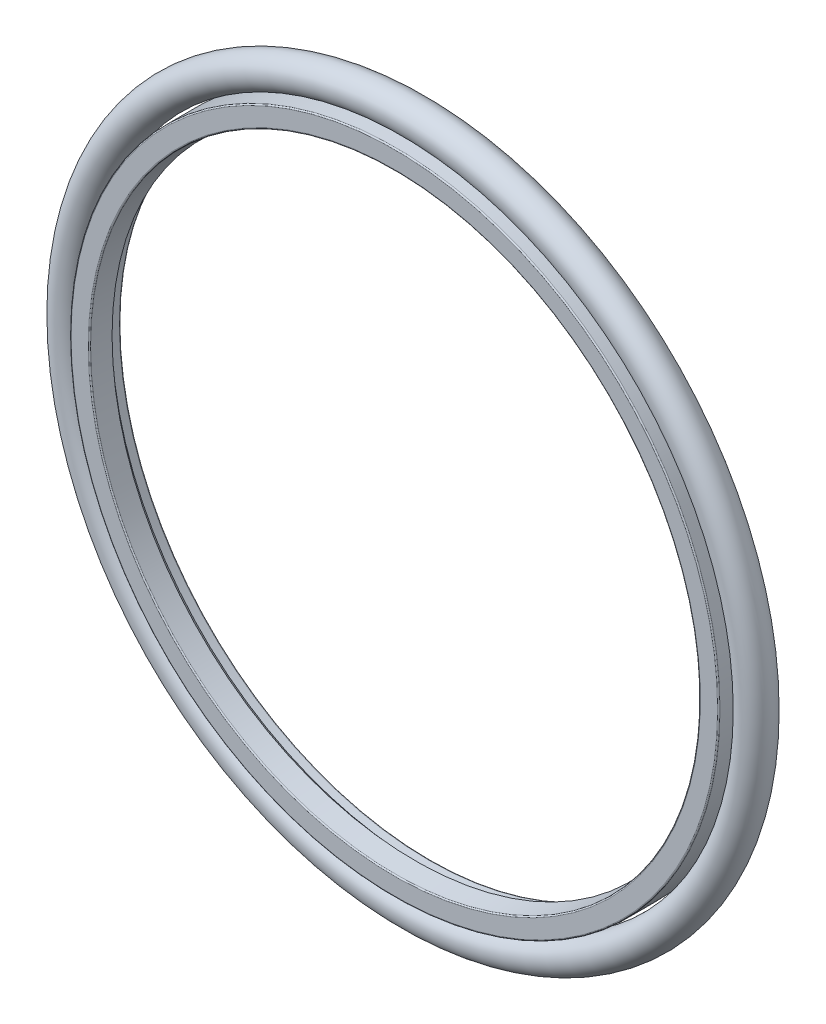
ISO-10303-21;
HEADER;
FILE_DESCRIPTION(('STEP AP214'),'2;1');
FILE_NAME('part.step','',(''),(''),'','','');
FILE_SCHEMA(('AUTOMOTIVE_DESIGN { 1 0 10303 214 1 1 1 1 }'));
ENDSEC;
DATA;
#1=APPLICATION_CONTEXT('core data for automotive mechanical design processes');
#2=APPLICATION_PROTOCOL_DEFINITION('international standard','automotive_design',2000,#1);
#3=PRODUCT_CONTEXT('',#1,'mechanical');
#4=PRODUCT('Part','Part','',(#3));
#5=PRODUCT_RELATED_PRODUCT_CATEGORY('part','',(#4));
#6=PRODUCT_DEFINITION_FORMATION('','',#4);
#7=PRODUCT_DEFINITION_CONTEXT('part definition',#1,'design');
#8=PRODUCT_DEFINITION('design','',#6,#7);
#9=PRODUCT_DEFINITION_SHAPE('','',#8);
#10=(LENGTH_UNIT() NAMED_UNIT(*) SI_UNIT(.MILLI.,.METRE.));
#11=(NAMED_UNIT(*) PLANE_ANGLE_UNIT() SI_UNIT($,.RADIAN.));
#12=(NAMED_UNIT(*) SI_UNIT($,.STERADIAN.) SOLID_ANGLE_UNIT());
#13=UNCERTAINTY_MEASURE_WITH_UNIT(LENGTH_MEASURE(1.E-05),#10,'distance_accuracy_value','');
#14=(GEOMETRIC_REPRESENTATION_CONTEXT(3) GLOBAL_UNCERTAINTY_ASSIGNED_CONTEXT((#13)) GLOBAL_UNIT_ASSIGNED_CONTEXT((#10,
#11,#12)) REPRESENTATION_CONTEXT('',''));
#15=CARTESIAN_POINT('',(0.,0.,0.));
#16=DIRECTION('',(0.,0.,1.));
#17=DIRECTION('',(1.,0.,0.));
#18=AXIS2_PLACEMENT_3D('',#15,#16,#17);
#19=CARTESIAN_POINT('',(0.,0.,2.86000000000003));
#20=DIRECTION('',(0.,0.,-1.));
#21=DIRECTION('',(-1.,0.,0.));
#22=AXIS2_PLACEMENT_3D('',#19,#20,#21);
#23=TOROIDAL_SURFACE('',#22,56.325,2.665);
#24=CARTESIAN_POINT('',(-58.99,0.,2.86000000000003));
#25=VERTEX_POINT('',#24);
#26=VERTEX_LOOP('',#25);
#27=FACE_BOUND('',#26,.T.);
#28=ADVANCED_FACE('F55',(#27),#23,.T.);
#29=CLOSED_SHELL('',(#28));
#30=MANIFOLD_SOLID_BREP('B2',#29);
#31=CARTESIAN_POINT('',(0.,0.,0.199999999999978));
#32=DIRECTION('',(0.,0.,-1.));
#33=DIRECTION('',(-1.,0.,0.));
#34=AXIS2_PLACEMENT_3D('',#31,#32,#33);
#35=TOROIDAL_SURFACE('',#34,51.05,0.199999999999999);
#36=CARTESIAN_POINT('',(0.,0.,0.));
#37=DIRECTION('',(0.,0.,-1.));
#38=DIRECTION('',(-1.,0.,0.));
#39=AXIS2_PLACEMENT_3D('',#36,#37,#38);
#40=CIRCLE('',#39,51.05);
#41=CARTESIAN_POINT('',(-51.05,0.,0.));
#42=VERTEX_POINT('',#41);
#43=EDGE_CURVE('E117',#42,#42,#40,.T.);
#44=ORIENTED_EDGE('',*,*,#43,.T.);
#45=EDGE_LOOP('',(#44));
#46=FACE_BOUND('',#45,.T.);
#47=CARTESIAN_POINT('',(0.,0.,0.199999999999978));
#48=DIRECTION('',(0.,0.,-1.));
#49=DIRECTION('',(-1.,0.,0.));
#50=AXIS2_PLACEMENT_3D('',#47,#48,#49);
#51=CIRCLE('',#50,50.85);
#52=CARTESIAN_POINT('',(-50.85,0.,0.199999999999978));
#53=VERTEX_POINT('',#52);
#54=EDGE_CURVE('E54',#53,#53,#51,.T.);
#55=ORIENTED_EDGE('',*,*,#54,.F.);
#56=EDGE_LOOP('',(#55));
#57=FACE_BOUND('',#56,.T.);
#58=ADVANCED_FACE('F72',(#46,#57),#35,.T.);
#59=CARTESIAN_POINT('',(0.,0.,0.));
#60=DIRECTION('',(0.,0.,-1.));
#61=DIRECTION('',(-1.,0.,0.));
#62=AXIS2_PLACEMENT_3D('',#59,#60,#61);
#63=CYLINDRICAL_SURFACE('',#62,50.85);
#64=ORIENTED_EDGE('',*,*,#54,.T.);
#65=EDGE_LOOP('',(#64));
#66=FACE_BOUND('',#65,.T.);
#67=CARTESIAN_POINT('',(0.,0.,1.5));
#68=DIRECTION('',(0.,0.,-1.));
#69=DIRECTION('',(-1.,0.,0.));
#70=AXIS2_PLACEMENT_3D('',#67,#68,#69);
#71=CIRCLE('',#70,50.85);
#72=CARTESIAN_POINT('',(-50.85,0.,1.5));
#73=VERTEX_POINT('',#72);
#74=EDGE_CURVE('E79',#73,#73,#71,.T.);
#75=ORIENTED_EDGE('',*,*,#74,.F.);
#76=EDGE_LOOP('',(#75));
#77=FACE_BOUND('',#76,.T.);
#78=ADVANCED_FACE('F137',(#66,#77),#63,.F.);
#79=CARTESIAN_POINT('',(0.,0.,2.5));
#80=DIRECTION('',(0.,0.,-1.));
#81=DIRECTION('',(-1.,0.,0.));
#82=AXIS2_PLACEMENT_3D('',#79,#80,#81);
#83=CONICAL_SURFACE('',#82,49.75,0.832981266674434);
#84=ORIENTED_EDGE('',*,*,#74,.T.);
#85=EDGE_LOOP('',(#84));
#86=FACE_BOUND('',#85,.T.);
#87=CARTESIAN_POINT('',(0.,0.,2.5));
#88=DIRECTION('',(0.,0.,-1.));
#89=DIRECTION('',(-1.,0.,0.));
#90=AXIS2_PLACEMENT_3D('',#87,#88,#89);
#91=CIRCLE('',#90,49.75);
#92=CARTESIAN_POINT('',(-49.75,0.,2.5));
#93=VERTEX_POINT('',#92);
#94=EDGE_CURVE('E85',#93,#93,#91,.T.);
#95=ORIENTED_EDGE('',*,*,#94,.F.);
#96=EDGE_LOOP('',(#95));
#97=FACE_BOUND('',#96,.T.);
#98=ADVANCED_FACE('F141',(#86,#97),#83,.F.);
#99=CARTESIAN_POINT('',(0.,0.,5.73747674954295));
#100=DIRECTION('',(0.,0.,1.));
#101=DIRECTION('',(1.,0.,0.));
#102=AXIS2_PLACEMENT_3D('',#99,#100,#101);
#103=CONICAL_SURFACE('',#102,50.0339891885564,0.0874953408023926);
#104=ORIENTED_EDGE('',*,*,#94,.T.);
#105=EDGE_LOOP('',(#104));
#106=FACE_BOUND('',#105,.T.);
#107=CARTESIAN_POINT('',(0.,0.,5.73747674954295));
#108=DIRECTION('',(0.,0.,-1.));
#109=DIRECTION('',(-1.,0.,0.));
#110=AXIS2_PLACEMENT_3D('',#107,#108,#109);
#111=CIRCLE('',#110,50.0339891885564);
#112=CARTESIAN_POINT('',(-50.0339891885564,0.,5.73747674954295));
#113=VERTEX_POINT('',#112);
#114=EDGE_CURVE('E91',#113,#113,#111,.T.);
#115=ORIENTED_EDGE('',*,*,#114,.F.);
#116=EDGE_LOOP('',(#115));
#117=FACE_BOUND('',#116,.T.);
#118=ADVANCED_FACE('F145',(#106,#117),#103,.F.);
#119=CARTESIAN_POINT('',(0.,0.,5.72));
#120=DIRECTION('',(0.,0.,-1.));
#121=DIRECTION('',(-1.,0.,0.));
#122=AXIS2_PLACEMENT_3D('',#119,#120,#121);
#123=TOROIDAL_SURFACE('',#122,50.2332241333462,0.199999999999999);
#124=ORIENTED_EDGE('',*,*,#114,.T.);
#125=EDGE_LOOP('',(#124));
#126=FACE_BOUND('',#125,.T.);
#127=CARTESIAN_POINT('',(0.,0.,5.91999999999998));
#128=DIRECTION('',(0.,0.,-1.));
#129=DIRECTION('',(-1.,0.,0.));
#130=AXIS2_PLACEMENT_3D('',#127,#128,#129);
#131=CIRCLE('',#130,50.2332241333462);
#132=CARTESIAN_POINT('',(-50.2332241333462,0.,5.91999999999998));
#133=VERTEX_POINT('',#132);
#134=EDGE_CURVE('E97',#133,#133,#131,.T.);
#135=ORIENTED_EDGE('',*,*,#134,.F.);
#136=EDGE_LOOP('',(#135));
#137=FACE_BOUND('',#136,.T.);
#138=ADVANCED_FACE('F151',(#126,#137),#123,.T.);
#139=CARTESIAN_POINT('',(0.,53.0499999999999,5.91999999999998));
#140=DIRECTION('',(0.,0.,1.));
#141=DIRECTION('',(1.,0.,0.));
#142=AXIS2_PLACEMENT_3D('',#139,#140,#141);
#143=PLANE('',#142);
#144=ORIENTED_EDGE('',*,*,#134,.T.);
#145=EDGE_LOOP('',(#144));
#146=FACE_BOUND('',#145,.T.);
#147=CARTESIAN_POINT('',(0.,0.,5.91999999999998));
#148=DIRECTION('',(0.,0.,-1.));
#149=DIRECTION('',(-1.,0.,0.));
#150=AXIS2_PLACEMENT_3D('',#147,#148,#149);
#151=CIRCLE('',#150,53.05);
#152=CARTESIAN_POINT('',(-53.05,0.,5.91999999999998));
#153=VERTEX_POINT('',#152);
#154=EDGE_CURVE('E101',#153,#153,#151,.T.);
#155=ORIENTED_EDGE('',*,*,#154,.F.);
#156=EDGE_LOOP('',(#155));
#157=FACE_BOUND('',#156,.T.);
#158=ADVANCED_FACE('F155',(#146,#157),#143,.T.);
#159=CARTESIAN_POINT('',(0.,0.,5.72));
#160=DIRECTION('',(0.,0.,-1.));
#161=DIRECTION('',(-1.,0.,0.));
#162=AXIS2_PLACEMENT_3D('',#159,#160,#161);
#163=TOROIDAL_SURFACE('',#162,53.05,0.199999999999999);
#164=ORIENTED_EDGE('',*,*,#154,.T.);
#165=EDGE_LOOP('',(#164));
#166=FACE_BOUND('',#165,.T.);
#167=CARTESIAN_POINT('',(0.,0.,5.72));
#168=DIRECTION('',(0.,0.,-1.));
#169=DIRECTION('',(-1.,0.,0.));
#170=AXIS2_PLACEMENT_3D('',#167,#168,#169);
#171=CIRCLE('',#170,53.25);
#172=CARTESIAN_POINT('',(-53.25,0.,5.72));
#173=VERTEX_POINT('',#172);
#174=EDGE_CURVE('E105',#173,#173,#171,.T.);
#175=ORIENTED_EDGE('',*,*,#174,.F.);
#176=EDGE_LOOP('',(#175));
#177=FACE_BOUND('',#176,.T.);
#178=ADVANCED_FACE('F159',(#166,#177),#163,.T.);
#179=CARTESIAN_POINT('',(0.,0.,0.));
#180=DIRECTION('',(0.,0.,-1.));
#181=DIRECTION('',(-1.,0.,0.));
#182=AXIS2_PLACEMENT_3D('',#179,#180,#181);
#183=CYLINDRICAL_SURFACE('',#182,53.25);
#184=ORIENTED_EDGE('',*,*,#174,.T.);
#185=EDGE_LOOP('',(#184));
#186=FACE_BOUND('',#185,.T.);
#187=CARTESIAN_POINT('',(0.,0.,0.199999999999978));
#188=DIRECTION('',(0.,0.,-1.));
#189=DIRECTION('',(-1.,0.,0.));
#190=AXIS2_PLACEMENT_3D('',#187,#188,#189);
#191=CIRCLE('',#190,53.25);
#192=CARTESIAN_POINT('',(-53.25,0.,0.199999999999978));
#193=VERTEX_POINT('',#192);
#194=EDGE_CURVE('E109',#193,#193,#191,.T.);
#195=ORIENTED_EDGE('',*,*,#194,.F.);
#196=EDGE_LOOP('',(#195));
#197=FACE_BOUND('',#196,.T.);
#198=ADVANCED_FACE('F133',(#186,#197),#183,.T.);
#199=CARTESIAN_POINT('',(0.,0.,0.199999999999978));
#200=DIRECTION('',(0.,0.,-1.));
#201=DIRECTION('',(-1.,0.,0.));
#202=AXIS2_PLACEMENT_3D('',#199,#200,#201);
#203=TOROIDAL_SURFACE('',#202,53.05,0.199999999999999);
#204=ORIENTED_EDGE('',*,*,#194,.T.);
#205=EDGE_LOOP('',(#204));
#206=FACE_BOUND('',#205,.T.);
#207=CARTESIAN_POINT('',(0.,0.,0.));
#208=DIRECTION('',(0.,0.,-1.));
#209=DIRECTION('',(-1.,0.,0.));
#210=AXIS2_PLACEMENT_3D('',#207,#208,#209);
#211=CIRCLE('',#210,53.05);
#212=CARTESIAN_POINT('',(-53.05,0.,0.));
#213=VERTEX_POINT('',#212);
#214=EDGE_CURVE('E113',#213,#213,#211,.T.);
#215=ORIENTED_EDGE('',*,*,#214,.F.);
#216=EDGE_LOOP('',(#215));
#217=FACE_BOUND('',#216,.T.);
#218=ADVANCED_FACE('F127',(#206,#217),#203,.T.);
#219=CARTESIAN_POINT('',(0.,51.0499999999997,0.));
#220=DIRECTION('',(0.,0.,-1.));
#221=DIRECTION('',(-1.,0.,0.));
#222=AXIS2_PLACEMENT_3D('',#219,#220,#221);
#223=PLANE('',#222);
#224=ORIENTED_EDGE('',*,*,#214,.T.);
#225=EDGE_LOOP('',(#224));
#226=FACE_BOUND('',#225,.T.);
#227=ORIENTED_EDGE('',*,*,#43,.F.);
#228=EDGE_LOOP('',(#227));
#229=FACE_BOUND('',#228,.T.);
#230=ADVANCED_FACE('F125',(#226,#229),#223,.T.);
#231=CLOSED_SHELL('',(#58,#78,#98,#118,#138,#158,#178,#198,#218,#230));
#232=MANIFOLD_SOLID_BREP('B6',#231);
#233=ADVANCED_BREP_SHAPE_REPRESENTATION('',(#18,#30,#232),#14);
#234=SHAPE_DEFINITION_REPRESENTATION(#9,#233);
ENDSEC;
END-ISO-10303-21;
